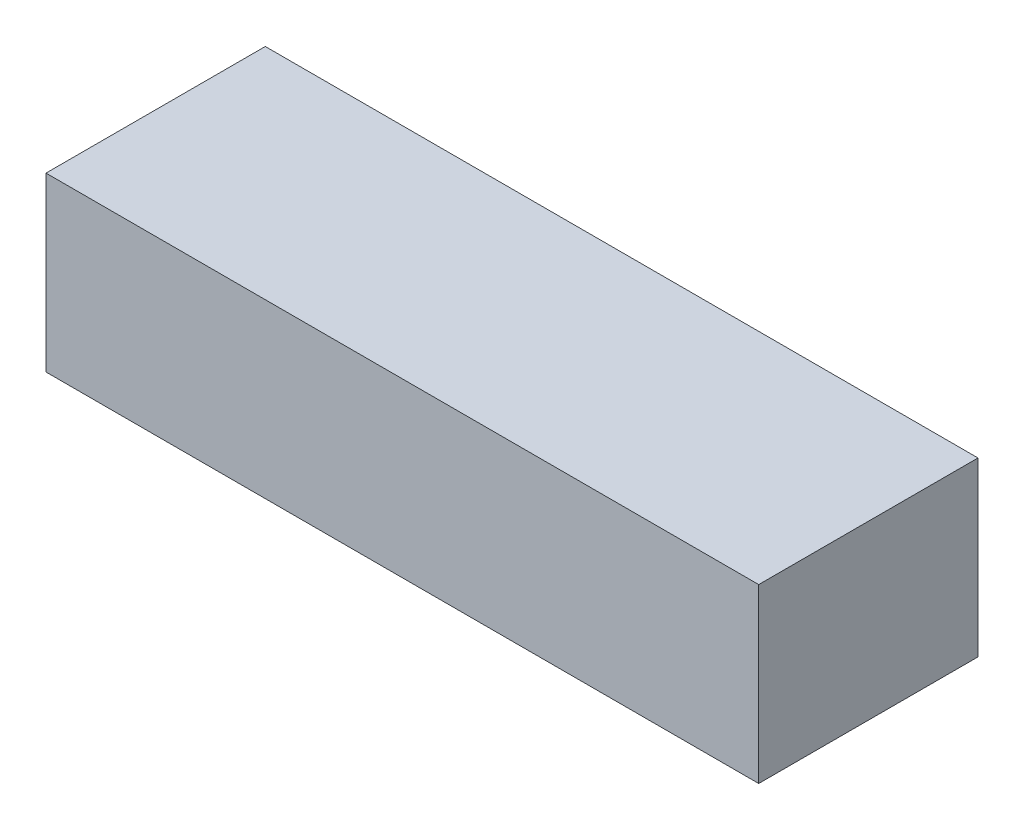
ISO-10303-21;
HEADER;
FILE_DESCRIPTION(('STEP AP214'),'2;1');
FILE_NAME('part.step','',(''),(''),'','','');
FILE_SCHEMA(('AUTOMOTIVE_DESIGN { 1 0 10303 214 1 1 1 1 }'));
ENDSEC;
DATA;
#1=APPLICATION_CONTEXT('core data for automotive mechanical design processes');
#2=APPLICATION_PROTOCOL_DEFINITION('international standard','automotive_design',2000,#1);
#3=PRODUCT_CONTEXT('',#1,'mechanical');
#4=PRODUCT('Part','Part','',(#3));
#5=PRODUCT_RELATED_PRODUCT_CATEGORY('part','',(#4));
#6=PRODUCT_DEFINITION_FORMATION('','',#4);
#7=PRODUCT_DEFINITION_CONTEXT('part definition',#1,'design');
#8=PRODUCT_DEFINITION('design','',#6,#7);
#9=PRODUCT_DEFINITION_SHAPE('','',#8);
#10=(LENGTH_UNIT() NAMED_UNIT(*) SI_UNIT(.MILLI.,.METRE.));
#11=(NAMED_UNIT(*) PLANE_ANGLE_UNIT() SI_UNIT($,.RADIAN.));
#12=(NAMED_UNIT(*) SI_UNIT($,.STERADIAN.) SOLID_ANGLE_UNIT());
#13=UNCERTAINTY_MEASURE_WITH_UNIT(LENGTH_MEASURE(1.E-05),#10,'distance_accuracy_value','');
#14=(GEOMETRIC_REPRESENTATION_CONTEXT(3) GLOBAL_UNCERTAINTY_ASSIGNED_CONTEXT((#13)) GLOBAL_UNIT_ASSIGNED_CONTEXT((#10,
#11,#12)) REPRESENTATION_CONTEXT('',''));
#15=CARTESIAN_POINT('',(0.,0.,0.));
#16=DIRECTION('',(0.,0.,1.));
#17=DIRECTION('',(1.,0.,0.));
#18=AXIS2_PLACEMENT_3D('',#15,#16,#17);
#19=CARTESIAN_POINT('',(91.,22.,0.));
#20=DIRECTION('',(0.,0.,1.));
#21=DIRECTION('',(1.,0.,0.));
#22=AXIS2_PLACEMENT_3D('',#19,#20,#21);
#23=PLANE('',#22);
#24=DIRECTION('',(-1.,0.,0.));
#25=VECTOR('',#24,1.);
#26=CARTESIAN_POINT('',(91.,0.,0.));
#27=LINE('',#26,#25);
#28=CARTESIAN_POINT('',(91.,0.,0.));
#29=VERTEX_POINT('',#28);
#30=CARTESIAN_POINT('',(0.,0.,0.));
#31=VERTEX_POINT('',#30);
#32=EDGE_CURVE('E104',#29,#31,#27,.T.);
#33=ORIENTED_EDGE('',*,*,#32,.T.);
#34=DIRECTION('',(0.,-1.,0.));
#35=VECTOR('',#34,1.);
#36=CARTESIAN_POINT('',(0.,22.,0.));
#37=LINE('',#36,#35);
#38=CARTESIAN_POINT('',(0.,22.,0.));
#39=VERTEX_POINT('',#38);
#40=EDGE_CURVE('E11',#39,#31,#37,.T.);
#41=ORIENTED_EDGE('',*,*,#40,.F.);
#42=DIRECTION('',(-1.,0.,0.));
#43=VECTOR('',#42,1.);
#44=CARTESIAN_POINT('',(91.,22.,0.));
#45=LINE('',#44,#43);
#46=CARTESIAN_POINT('',(91.,22.,0.));
#47=VERTEX_POINT('',#46);
#48=EDGE_CURVE('E92',#47,#39,#45,.T.);
#49=ORIENTED_EDGE('',*,*,#48,.F.);
#50=DIRECTION('',(0.,-1.,0.));
#51=VECTOR('',#50,1.);
#52=CARTESIAN_POINT('',(91.,22.,0.));
#53=LINE('',#52,#51);
#54=EDGE_CURVE('E100',#47,#29,#53,.T.);
#55=ORIENTED_EDGE('',*,*,#54,.T.);
#56=EDGE_LOOP('',(#33,#41,#49,#55));
#57=FACE_BOUND('',#56,.T.);
#58=ADVANCED_FACE('F41',(#57),#23,.F.);
#59=CARTESIAN_POINT('',(0.,22.,0.));
#60=DIRECTION('',(1.,0.,0.));
#61=DIRECTION('',(0.,0.,-1.));
#62=AXIS2_PLACEMENT_3D('',#59,#60,#61);
#63=PLANE('',#62);
#64=DIRECTION('',(0.,0.,1.));
#65=VECTOR('',#64,1.);
#66=CARTESIAN_POINT('',(0.,0.,0.));
#67=LINE('',#66,#65);
#68=CARTESIAN_POINT('',(0.,0.,28.));
#69=VERTEX_POINT('',#68);
#70=EDGE_CURVE('E96',#31,#69,#67,.T.);
#71=ORIENTED_EDGE('',*,*,#70,.T.);
#72=DIRECTION('',(0.,-1.,0.));
#73=VECTOR('',#72,1.);
#74=CARTESIAN_POINT('',(0.,22.,28.));
#75=LINE('',#74,#73);
#76=CARTESIAN_POINT('',(0.,22.,28.));
#77=VERTEX_POINT('',#76);
#78=EDGE_CURVE('E49',#77,#69,#75,.T.);
#79=ORIENTED_EDGE('',*,*,#78,.F.);
#80=DIRECTION('',(0.,0.,1.));
#81=VECTOR('',#80,1.);
#82=CARTESIAN_POINT('',(0.,22.,0.));
#83=LINE('',#82,#81);
#84=EDGE_CURVE('E87',#39,#77,#83,.T.);
#85=ORIENTED_EDGE('',*,*,#84,.F.);
#86=ORIENTED_EDGE('',*,*,#40,.T.);
#87=EDGE_LOOP('',(#71,#79,#85,#86));
#88=FACE_BOUND('',#87,.T.);
#89=ADVANCED_FACE('F95',(#88),#63,.F.);
#90=CARTESIAN_POINT('',(0.,22.,28.));
#91=DIRECTION('',(0.,0.,-1.));
#92=DIRECTION('',(-1.,0.,0.));
#93=AXIS2_PLACEMENT_3D('',#90,#91,#92);
#94=PLANE('',#93);
#95=DIRECTION('',(1.,0.,0.));
#96=VECTOR('',#95,1.);
#97=CARTESIAN_POINT('',(0.,0.,28.));
#98=LINE('',#97,#96);
#99=CARTESIAN_POINT('',(91.,0.,28.));
#100=VERTEX_POINT('',#99);
#101=EDGE_CURVE('E74',#69,#100,#98,.T.);
#102=ORIENTED_EDGE('',*,*,#101,.T.);
#103=DIRECTION('',(0.,-1.,0.));
#104=VECTOR('',#103,1.);
#105=CARTESIAN_POINT('',(91.,22.,28.));
#106=LINE('',#105,#104);
#107=CARTESIAN_POINT('',(91.,22.,28.));
#108=VERTEX_POINT('',#107);
#109=EDGE_CURVE('E97',#108,#100,#106,.T.);
#110=ORIENTED_EDGE('',*,*,#109,.F.);
#111=DIRECTION('',(1.,0.,0.));
#112=VECTOR('',#111,1.);
#113=CARTESIAN_POINT('',(0.,22.,28.));
#114=LINE('',#113,#112);
#115=EDGE_CURVE('E90',#77,#108,#114,.T.);
#116=ORIENTED_EDGE('',*,*,#115,.F.);
#117=ORIENTED_EDGE('',*,*,#78,.T.);
#118=EDGE_LOOP('',(#102,#110,#116,#117));
#119=FACE_BOUND('',#118,.T.);
#120=ADVANCED_FACE('F98',(#119),#94,.F.);
#121=CARTESIAN_POINT('',(91.,22.,28.));
#122=DIRECTION('',(-1.,0.,0.));
#123=DIRECTION('',(0.,0.,1.));
#124=AXIS2_PLACEMENT_3D('',#121,#122,#123);
#125=PLANE('',#124);
#126=DIRECTION('',(0.,0.,-1.));
#127=VECTOR('',#126,1.);
#128=CARTESIAN_POINT('',(91.,0.,28.));
#129=LINE('',#128,#127);
#130=EDGE_CURVE('E80',#100,#29,#129,.T.);
#131=ORIENTED_EDGE('',*,*,#130,.T.);
#132=ORIENTED_EDGE('',*,*,#54,.F.);
#133=DIRECTION('',(0.,0.,-1.));
#134=VECTOR('',#133,1.);
#135=CARTESIAN_POINT('',(91.,22.,28.));
#136=LINE('',#135,#134);
#137=EDGE_CURVE('E57',#108,#47,#136,.T.);
#138=ORIENTED_EDGE('',*,*,#137,.F.);
#139=ORIENTED_EDGE('',*,*,#109,.T.);
#140=EDGE_LOOP('',(#131,#132,#138,#139));
#141=FACE_BOUND('',#140,.T.);
#142=ADVANCED_FACE('F111',(#141),#125,.F.);
#143=CARTESIAN_POINT('',(0.,22.,0.));
#144=DIRECTION('',(0.,1.,0.));
#145=DIRECTION('',(0.,0.,1.));
#146=AXIS2_PLACEMENT_3D('',#143,#144,#145);
#147=PLANE('',#146);
#148=ORIENTED_EDGE('',*,*,#48,.T.);
#149=ORIENTED_EDGE('',*,*,#84,.T.);
#150=ORIENTED_EDGE('',*,*,#115,.T.);
#151=ORIENTED_EDGE('',*,*,#137,.T.);
#152=EDGE_LOOP('',(#148,#149,#150,#151));
#153=FACE_BOUND('',#152,.T.);
#154=ADVANCED_FACE('F88',(#153),#147,.T.);
#155=CARTESIAN_POINT('',(0.,0.,0.));
#156=DIRECTION('',(0.,1.,0.));
#157=DIRECTION('',(0.,0.,1.));
#158=AXIS2_PLACEMENT_3D('',#155,#156,#157);
#159=PLANE('',#158);
#160=ORIENTED_EDGE('',*,*,#32,.F.);
#161=ORIENTED_EDGE('',*,*,#130,.F.);
#162=ORIENTED_EDGE('',*,*,#101,.F.);
#163=ORIENTED_EDGE('',*,*,#70,.F.);
#164=EDGE_LOOP('',(#160,#161,#162,#163));
#165=FACE_BOUND('',#164,.T.);
#166=ADVANCED_FACE('F114',(#165),#159,.F.);
#167=CLOSED_SHELL('',(#58,#89,#120,#142,#154,#166));
#168=MANIFOLD_SOLID_BREP('B2',#167);
#169=ADVANCED_BREP_SHAPE_REPRESENTATION('',(#18,#168),#14);
#170=SHAPE_DEFINITION_REPRESENTATION(#9,#169);
ENDSEC;
END-ISO-10303-21;
